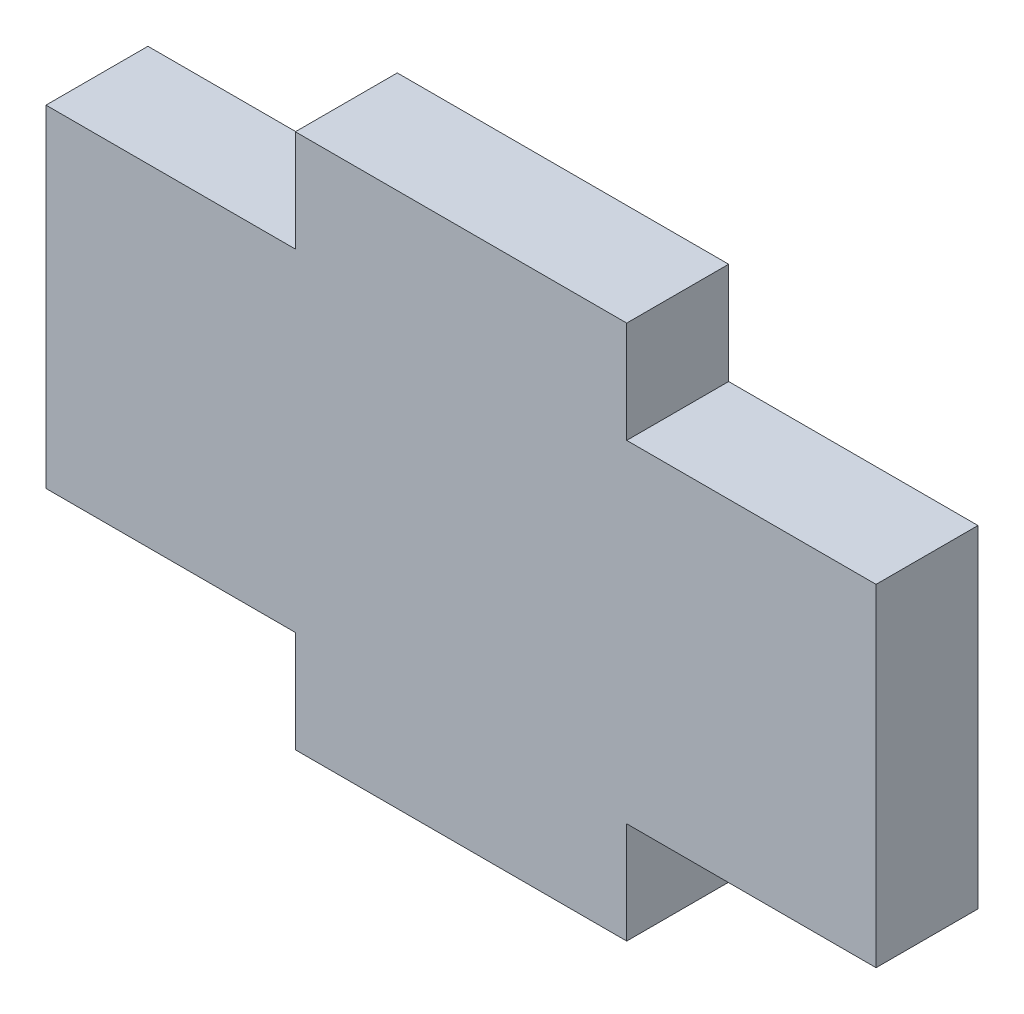
ISO-10303-21;
HEADER;
FILE_DESCRIPTION(('STEP AP214'),'2;1');
FILE_NAME('part.step','',(''),(''),'','','');
FILE_SCHEMA(('AUTOMOTIVE_DESIGN { 1 0 10303 214 1 1 1 1 }'));
ENDSEC;
DATA;
#1=APPLICATION_CONTEXT('core data for automotive mechanical design processes');
#2=APPLICATION_PROTOCOL_DEFINITION('international standard','automotive_design',2000,#1);
#3=PRODUCT_CONTEXT('',#1,'mechanical');
#4=PRODUCT('Part','Part','',(#3));
#5=PRODUCT_RELATED_PRODUCT_CATEGORY('part','',(#4));
#6=PRODUCT_DEFINITION_FORMATION('','',#4);
#7=PRODUCT_DEFINITION_CONTEXT('part definition',#1,'design');
#8=PRODUCT_DEFINITION('design','',#6,#7);
#9=PRODUCT_DEFINITION_SHAPE('','',#8);
#10=(LENGTH_UNIT() NAMED_UNIT(*) SI_UNIT(.MILLI.,.METRE.));
#11=(NAMED_UNIT(*) PLANE_ANGLE_UNIT() SI_UNIT($,.RADIAN.));
#12=(NAMED_UNIT(*) SI_UNIT($,.STERADIAN.) SOLID_ANGLE_UNIT());
#13=UNCERTAINTY_MEASURE_WITH_UNIT(LENGTH_MEASURE(1.E-05),#10,'distance_accuracy_value','');
#14=(GEOMETRIC_REPRESENTATION_CONTEXT(3) GLOBAL_UNCERTAINTY_ASSIGNED_CONTEXT((#13)) GLOBAL_UNIT_ASSIGNED_CONTEXT((#10,
#11,#12)) REPRESENTATION_CONTEXT('',''));
#15=CARTESIAN_POINT('',(0.,0.,0.));
#16=DIRECTION('',(0.,0.,1.));
#17=DIRECTION('',(1.,0.,0.));
#18=AXIS2_PLACEMENT_3D('',#15,#16,#17);
#19=CARTESIAN_POINT('',(-24.99,-295.75,-3.08));
#20=DIRECTION('',(0.,-1.,0.));
#21=DIRECTION('',(0.,0.,-1.));
#22=AXIS2_PLACEMENT_3D('',#19,#20,#21);
#23=PLANE('',#22);
#24=DIRECTION('',(1.,0.,0.));
#25=VECTOR('',#24,1.);
#26=CARTESIAN_POINT('',(-24.99,-295.75,-6.15));
#27=LINE('',#26,#25);
#28=CARTESIAN_POINT('',(-24.99,-295.75,-6.15));
#29=VERTEX_POINT('',#28);
#30=CARTESIAN_POINT('',(-15.01,-295.75,-6.15));
#31=VERTEX_POINT('',#30);
#32=EDGE_CURVE('E163',#29,#31,#27,.T.);
#33=ORIENTED_EDGE('',*,*,#32,.F.);
#34=DIRECTION('',(0.,0.,-1.));
#35=VECTOR('',#34,1.);
#36=CARTESIAN_POINT('',(-24.99,-295.75,-3.08));
#37=LINE('',#36,#35);
#38=CARTESIAN_POINT('',(-24.99,-295.75,-3.08));
#39=VERTEX_POINT('',#38);
#40=EDGE_CURVE('E162',#39,#29,#37,.T.);
#41=ORIENTED_EDGE('',*,*,#40,.F.);
#42=DIRECTION('',(1.,0.,0.));
#43=VECTOR('',#42,1.);
#44=CARTESIAN_POINT('',(-24.99,-295.75,-3.08));
#45=LINE('',#44,#43);
#46=CARTESIAN_POINT('',(-15.01,-295.75,-3.08));
#47=VERTEX_POINT('',#46);
#48=EDGE_CURVE('E193',#39,#47,#45,.T.);
#49=ORIENTED_EDGE('',*,*,#48,.T.);
#50=DIRECTION('',(0.,0.,-1.));
#51=VECTOR('',#50,1.);
#52=CARTESIAN_POINT('',(-15.01,-295.75,-3.08));
#53=LINE('',#52,#51);
#54=EDGE_CURVE('E11',#47,#31,#53,.T.);
#55=ORIENTED_EDGE('',*,*,#54,.T.);
#56=EDGE_LOOP('',(#33,#41,#49,#55));
#57=FACE_BOUND('',#56,.T.);
#58=ADVANCED_FACE('F43',(#57),#23,.F.);
#59=CARTESIAN_POINT('',(-15.01,-295.75,-3.08));
#60=DIRECTION('',(-1.,0.,0.));
#61=DIRECTION('',(0.,0.,-1.));
#62=AXIS2_PLACEMENT_3D('',#59,#60,#61);
#63=PLANE('',#62);
#64=DIRECTION('',(0.,-1.,0.));
#65=VECTOR('',#64,1.);
#66=CARTESIAN_POINT('',(-15.01,-295.75,-6.15));
#67=LINE('',#66,#65);
#68=CARTESIAN_POINT('',(-15.01,-298.81,-6.15));
#69=VERTEX_POINT('',#68);
#70=EDGE_CURVE('E165',#31,#69,#67,.T.);
#71=ORIENTED_EDGE('',*,*,#70,.F.);
#72=ORIENTED_EDGE('',*,*,#54,.F.);
#73=DIRECTION('',(0.,-1.,0.));
#74=VECTOR('',#73,1.);
#75=CARTESIAN_POINT('',(-15.01,-295.75,-3.08));
#76=LINE('',#75,#74);
#77=CARTESIAN_POINT('',(-15.01,-298.81,-3.08));
#78=VERTEX_POINT('',#77);
#79=EDGE_CURVE('E109',#47,#78,#76,.T.);
#80=ORIENTED_EDGE('',*,*,#79,.T.);
#81=DIRECTION('',(0.,0.,-1.));
#82=VECTOR('',#81,1.);
#83=CARTESIAN_POINT('',(-15.01,-298.81,-3.08));
#84=LINE('',#83,#82);
#85=EDGE_CURVE('E51',#78,#69,#84,.T.);
#86=ORIENTED_EDGE('',*,*,#85,.T.);
#87=EDGE_LOOP('',(#71,#72,#80,#86));
#88=FACE_BOUND('',#87,.T.);
#89=ADVANCED_FACE('F217',(#88),#63,.F.);
#90=CARTESIAN_POINT('',(-15.01,-298.81,-3.08));
#91=DIRECTION('',(0.,-1.,0.));
#92=DIRECTION('',(0.,0.,-1.));
#93=AXIS2_PLACEMENT_3D('',#90,#91,#92);
#94=PLANE('',#93);
#95=DIRECTION('',(1.,0.,0.));
#96=VECTOR('',#95,1.);
#97=CARTESIAN_POINT('',(-15.01,-298.81,-6.15));
#98=LINE('',#97,#96);
#99=CARTESIAN_POINT('',(-7.5,-298.81,-6.15));
#100=VERTEX_POINT('',#99);
#101=EDGE_CURVE('E168',#69,#100,#98,.T.);
#102=ORIENTED_EDGE('',*,*,#101,.F.);
#103=ORIENTED_EDGE('',*,*,#85,.F.);
#104=DIRECTION('',(1.,0.,0.));
#105=VECTOR('',#104,1.);
#106=CARTESIAN_POINT('',(-15.01,-298.81,-3.08));
#107=LINE('',#106,#105);
#108=CARTESIAN_POINT('',(-7.5,-298.81,-3.08));
#109=VERTEX_POINT('',#108);
#110=EDGE_CURVE('E226',#78,#109,#107,.T.);
#111=ORIENTED_EDGE('',*,*,#110,.T.);
#112=DIRECTION('',(0.,0.,-1.));
#113=VECTOR('',#112,1.);
#114=CARTESIAN_POINT('',(-7.5,-298.81,-3.08));
#115=LINE('',#114,#113);
#116=EDGE_CURVE('E212',#109,#100,#115,.T.);
#117=ORIENTED_EDGE('',*,*,#116,.T.);
#118=EDGE_LOOP('',(#102,#103,#111,#117));
#119=FACE_BOUND('',#118,.T.);
#120=ADVANCED_FACE('F260',(#119),#94,.F.);
#121=CARTESIAN_POINT('',(-7.5,-298.81,-3.08));
#122=DIRECTION('',(-1.,0.,0.));
#123=DIRECTION('',(0.,1.,0.));
#124=AXIS2_PLACEMENT_3D('',#121,#122,#123);
#125=PLANE('',#124);
#126=DIRECTION('',(0.,-1.,0.));
#127=VECTOR('',#126,1.);
#128=CARTESIAN_POINT('',(-7.5,-298.81,-6.15));
#129=LINE('',#128,#127);
#130=CARTESIAN_POINT('',(-7.5,-308.81,-6.15));
#131=VERTEX_POINT('',#130);
#132=EDGE_CURVE('E171',#100,#131,#129,.T.);
#133=ORIENTED_EDGE('',*,*,#132,.F.);
#134=ORIENTED_EDGE('',*,*,#116,.F.);
#135=DIRECTION('',(0.,-1.,0.));
#136=VECTOR('',#135,1.);
#137=CARTESIAN_POINT('',(-7.5,-298.81,-3.08));
#138=LINE('',#137,#136);
#139=CARTESIAN_POINT('',(-7.5,-308.81,-3.08));
#140=VERTEX_POINT('',#139);
#141=EDGE_CURVE('E230',#109,#140,#138,.T.);
#142=ORIENTED_EDGE('',*,*,#141,.T.);
#143=DIRECTION('',(0.,0.,-1.));
#144=VECTOR('',#143,1.);
#145=CARTESIAN_POINT('',(-7.5,-308.81,-3.08));
#146=LINE('',#145,#144);
#147=EDGE_CURVE('E209',#140,#131,#146,.T.);
#148=ORIENTED_EDGE('',*,*,#147,.T.);
#149=EDGE_LOOP('',(#133,#134,#142,#148));
#150=FACE_BOUND('',#149,.T.);
#151=ADVANCED_FACE('F259',(#150),#125,.F.);
#152=CARTESIAN_POINT('',(-7.5,-308.81,-3.08));
#153=DIRECTION('',(0.,1.,0.));
#154=DIRECTION('',(0.,0.,1.));
#155=AXIS2_PLACEMENT_3D('',#152,#153,#154);
#156=PLANE('',#155);
#157=DIRECTION('',(-1.,0.,0.));
#158=VECTOR('',#157,1.);
#159=CARTESIAN_POINT('',(-7.5,-308.81,-6.15));
#160=LINE('',#159,#158);
#161=CARTESIAN_POINT('',(-15.01,-308.81,-6.15));
#162=VERTEX_POINT('',#161);
#163=EDGE_CURVE('E174',#131,#162,#160,.T.);
#164=ORIENTED_EDGE('',*,*,#163,.F.);
#165=ORIENTED_EDGE('',*,*,#147,.F.);
#166=DIRECTION('',(-1.,0.,0.));
#167=VECTOR('',#166,1.);
#168=CARTESIAN_POINT('',(-7.5,-308.81,-3.08));
#169=LINE('',#168,#167);
#170=CARTESIAN_POINT('',(-15.01,-308.81,-3.08));
#171=VERTEX_POINT('',#170);
#172=EDGE_CURVE('E233',#140,#171,#169,.T.);
#173=ORIENTED_EDGE('',*,*,#172,.T.);
#174=DIRECTION('',(0.,0.,-1.));
#175=VECTOR('',#174,1.);
#176=CARTESIAN_POINT('',(-15.01,-308.81,-3.08));
#177=LINE('',#176,#175);
#178=EDGE_CURVE('E206',#171,#162,#177,.T.);
#179=ORIENTED_EDGE('',*,*,#178,.T.);
#180=EDGE_LOOP('',(#164,#165,#173,#179));
#181=FACE_BOUND('',#180,.T.);
#182=ADVANCED_FACE('F257',(#181),#156,.F.);
#183=CARTESIAN_POINT('',(-15.01,-308.81,-3.08));
#184=DIRECTION('',(-1.,0.,0.));
#185=DIRECTION('',(0.,0.,-1.));
#186=AXIS2_PLACEMENT_3D('',#183,#184,#185);
#187=PLANE('',#186);
#188=DIRECTION('',(0.,-1.,0.));
#189=VECTOR('',#188,1.);
#190=CARTESIAN_POINT('',(-15.01,-308.81,-6.15));
#191=LINE('',#190,#189);
#192=CARTESIAN_POINT('',(-15.01,-311.87,-6.15));
#193=VERTEX_POINT('',#192);
#194=EDGE_CURVE('E177',#162,#193,#191,.T.);
#195=ORIENTED_EDGE('',*,*,#194,.F.);
#196=ORIENTED_EDGE('',*,*,#178,.F.);
#197=DIRECTION('',(0.,-1.,0.));
#198=VECTOR('',#197,1.);
#199=CARTESIAN_POINT('',(-15.01,-308.81,-3.08));
#200=LINE('',#199,#198);
#201=CARTESIAN_POINT('',(-15.01,-311.87,-3.08));
#202=VERTEX_POINT('',#201);
#203=EDGE_CURVE('E236',#171,#202,#200,.T.);
#204=ORIENTED_EDGE('',*,*,#203,.T.);
#205=DIRECTION('',(0.,0.,-1.));
#206=VECTOR('',#205,1.);
#207=CARTESIAN_POINT('',(-15.01,-311.87,-3.08));
#208=LINE('',#207,#206);
#209=EDGE_CURVE('E203',#202,#193,#208,.T.);
#210=ORIENTED_EDGE('',*,*,#209,.T.);
#211=EDGE_LOOP('',(#195,#196,#204,#210));
#212=FACE_BOUND('',#211,.T.);
#213=ADVANCED_FACE('F253',(#212),#187,.F.);
#214=CARTESIAN_POINT('',(-15.01,-311.87,-3.08));
#215=DIRECTION('',(0.,1.,0.));
#216=DIRECTION('',(0.,0.,1.));
#217=AXIS2_PLACEMENT_3D('',#214,#215,#216);
#218=PLANE('',#217);
#219=DIRECTION('',(-1.,0.,0.));
#220=VECTOR('',#219,1.);
#221=CARTESIAN_POINT('',(-15.01,-311.87,-6.15));
#222=LINE('',#221,#220);
#223=CARTESIAN_POINT('',(-24.99,-311.87,-6.15));
#224=VERTEX_POINT('',#223);
#225=EDGE_CURVE('E180',#193,#224,#222,.T.);
#226=ORIENTED_EDGE('',*,*,#225,.F.);
#227=ORIENTED_EDGE('',*,*,#209,.F.);
#228=DIRECTION('',(-1.,0.,0.));
#229=VECTOR('',#228,1.);
#230=CARTESIAN_POINT('',(-15.01,-311.87,-3.08));
#231=LINE('',#230,#229);
#232=CARTESIAN_POINT('',(-24.99,-311.87,-3.08));
#233=VERTEX_POINT('',#232);
#234=EDGE_CURVE('E239',#202,#233,#231,.T.);
#235=ORIENTED_EDGE('',*,*,#234,.T.);
#236=DIRECTION('',(0.,0.,-1.));
#237=VECTOR('',#236,1.);
#238=CARTESIAN_POINT('',(-24.99,-311.87,-3.08));
#239=LINE('',#238,#237);
#240=EDGE_CURVE('E200',#233,#224,#239,.T.);
#241=ORIENTED_EDGE('',*,*,#240,.T.);
#242=EDGE_LOOP('',(#226,#227,#235,#241));
#243=FACE_BOUND('',#242,.T.);
#244=ADVANCED_FACE('F250',(#243),#218,.F.);
#245=CARTESIAN_POINT('',(-24.99,-311.87,-3.08));
#246=DIRECTION('',(1.,0.,0.));
#247=DIRECTION('',(0.,0.,1.));
#248=AXIS2_PLACEMENT_3D('',#245,#246,#247);
#249=PLANE('',#248);
#250=DIRECTION('',(0.,1.,0.));
#251=VECTOR('',#250,1.);
#252=CARTESIAN_POINT('',(-24.99,-311.87,-6.15));
#253=LINE('',#252,#251);
#254=CARTESIAN_POINT('',(-24.99,-308.81,-6.15));
#255=VERTEX_POINT('',#254);
#256=EDGE_CURVE('E183',#224,#255,#253,.T.);
#257=ORIENTED_EDGE('',*,*,#256,.F.);
#258=ORIENTED_EDGE('',*,*,#240,.F.);
#259=DIRECTION('',(0.,1.,0.));
#260=VECTOR('',#259,1.);
#261=CARTESIAN_POINT('',(-24.99,-311.87,-3.08));
#262=LINE('',#261,#260);
#263=CARTESIAN_POINT('',(-24.99,-308.81,-3.08));
#264=VERTEX_POINT('',#263);
#265=EDGE_CURVE('E157',#233,#264,#262,.T.);
#266=ORIENTED_EDGE('',*,*,#265,.T.);
#267=DIRECTION('',(0.,0.,-1.));
#268=VECTOR('',#267,1.);
#269=CARTESIAN_POINT('',(-24.99,-308.81,-3.08));
#270=LINE('',#269,#268);
#271=EDGE_CURVE('E197',#264,#255,#270,.T.);
#272=ORIENTED_EDGE('',*,*,#271,.T.);
#273=EDGE_LOOP('',(#257,#258,#266,#272));
#274=FACE_BOUND('',#273,.T.);
#275=ADVANCED_FACE('F244',(#274),#249,.F.);
#276=CARTESIAN_POINT('',(-24.99,-308.81,-3.08));
#277=DIRECTION('',(0.,1.,0.));
#278=DIRECTION('',(0.,0.,1.));
#279=AXIS2_PLACEMENT_3D('',#276,#277,#278);
#280=PLANE('',#279);
#281=DIRECTION('',(-1.,0.,0.));
#282=VECTOR('',#281,1.);
#283=CARTESIAN_POINT('',(-24.99,-308.81,-6.15));
#284=LINE('',#283,#282);
#285=CARTESIAN_POINT('',(-32.5,-308.81,-6.15));
#286=VERTEX_POINT('',#285);
#287=EDGE_CURVE('E186',#255,#286,#284,.T.);
#288=ORIENTED_EDGE('',*,*,#287,.F.);
#289=ORIENTED_EDGE('',*,*,#271,.F.);
#290=DIRECTION('',(-1.,0.,0.));
#291=VECTOR('',#290,1.);
#292=CARTESIAN_POINT('',(-24.99,-308.81,-3.08));
#293=LINE('',#292,#291);
#294=CARTESIAN_POINT('',(-32.5,-308.81,-3.08));
#295=VERTEX_POINT('',#294);
#296=EDGE_CURVE('E155',#264,#295,#293,.T.);
#297=ORIENTED_EDGE('',*,*,#296,.T.);
#298=DIRECTION('',(0.,0.,-1.));
#299=VECTOR('',#298,1.);
#300=CARTESIAN_POINT('',(-32.5,-308.81,-3.08));
#301=LINE('',#300,#299);
#302=EDGE_CURVE('E149',#295,#286,#301,.T.);
#303=ORIENTED_EDGE('',*,*,#302,.T.);
#304=EDGE_LOOP('',(#288,#289,#297,#303));
#305=FACE_BOUND('',#304,.T.);
#306=ADVANCED_FACE('F248',(#305),#280,.F.);
#307=CARTESIAN_POINT('',(-32.5,-308.81,-3.08));
#308=DIRECTION('',(1.,0.,0.));
#309=DIRECTION('',(0.,0.,1.));
#310=AXIS2_PLACEMENT_3D('',#307,#308,#309);
#311=PLANE('',#310);
#312=DIRECTION('',(0.,1.,0.));
#313=VECTOR('',#312,1.);
#314=CARTESIAN_POINT('',(-32.5,-308.81,-6.15));
#315=LINE('',#314,#313);
#316=CARTESIAN_POINT('',(-32.5,-298.81,-6.15));
#317=VERTEX_POINT('',#316);
#318=EDGE_CURVE('E189',#286,#317,#315,.T.);
#319=ORIENTED_EDGE('',*,*,#318,.F.);
#320=ORIENTED_EDGE('',*,*,#302,.F.);
#321=DIRECTION('',(0.,1.,0.));
#322=VECTOR('',#321,1.);
#323=CARTESIAN_POINT('',(-32.5,-308.81,-3.08));
#324=LINE('',#323,#322);
#325=CARTESIAN_POINT('',(-32.5,-298.81,-3.08));
#326=VERTEX_POINT('',#325);
#327=EDGE_CURVE('E139',#295,#326,#324,.T.);
#328=ORIENTED_EDGE('',*,*,#327,.T.);
#329=DIRECTION('',(0.,0.,-1.));
#330=VECTOR('',#329,1.);
#331=CARTESIAN_POINT('',(-32.5,-298.81,-3.08));
#332=LINE('',#331,#330);
#333=EDGE_CURVE('E144',#326,#317,#332,.T.);
#334=ORIENTED_EDGE('',*,*,#333,.T.);
#335=EDGE_LOOP('',(#319,#320,#328,#334));
#336=FACE_BOUND('',#335,.T.);
#337=ADVANCED_FACE('F152',(#336),#311,.F.);
#338=CARTESIAN_POINT('',(-32.5,-298.81,-3.08));
#339=DIRECTION('',(0.,-1.,0.));
#340=DIRECTION('',(0.,0.,-1.));
#341=AXIS2_PLACEMENT_3D('',#338,#339,#340);
#342=PLANE('',#341);
#343=DIRECTION('',(1.,0.,0.));
#344=VECTOR('',#343,1.);
#345=CARTESIAN_POINT('',(-32.5,-298.81,-6.15));
#346=LINE('',#345,#344);
#347=CARTESIAN_POINT('',(-24.99,-298.81,-6.15));
#348=VERTEX_POINT('',#347);
#349=EDGE_CURVE('E146',#317,#348,#346,.T.);
#350=ORIENTED_EDGE('',*,*,#349,.F.);
#351=ORIENTED_EDGE('',*,*,#333,.F.);
#352=DIRECTION('',(1.,0.,0.));
#353=VECTOR('',#352,1.);
#354=CARTESIAN_POINT('',(-32.5,-298.81,-3.08));
#355=LINE('',#354,#353);
#356=CARTESIAN_POINT('',(-24.99,-298.81,-3.08));
#357=VERTEX_POINT('',#356);
#358=EDGE_CURVE('E135',#326,#357,#355,.T.);
#359=ORIENTED_EDGE('',*,*,#358,.T.);
#360=DIRECTION('',(0.,0.,-1.));
#361=VECTOR('',#360,1.);
#362=CARTESIAN_POINT('',(-24.99,-298.81,-3.08));
#363=LINE('',#362,#361);
#364=EDGE_CURVE('E150',#357,#348,#363,.T.);
#365=ORIENTED_EDGE('',*,*,#364,.T.);
#366=EDGE_LOOP('',(#350,#351,#359,#365));
#367=FACE_BOUND('',#366,.T.);
#368=ADVANCED_FACE('F145',(#367),#342,.F.);
#369=CARTESIAN_POINT('',(-24.99,-298.81,-3.08));
#370=DIRECTION('',(1.,0.,0.));
#371=DIRECTION('',(0.,0.,1.));
#372=AXIS2_PLACEMENT_3D('',#369,#370,#371);
#373=PLANE('',#372);
#374=DIRECTION('',(0.,1.,0.));
#375=VECTOR('',#374,1.);
#376=CARTESIAN_POINT('',(-24.99,-298.81,-6.15));
#377=LINE('',#376,#375);
#378=EDGE_CURVE('E97',#348,#29,#377,.T.);
#379=ORIENTED_EDGE('',*,*,#378,.F.);
#380=ORIENTED_EDGE('',*,*,#364,.F.);
#381=DIRECTION('',(0.,1.,0.));
#382=VECTOR('',#381,1.);
#383=CARTESIAN_POINT('',(-24.99,-298.81,-3.08));
#384=LINE('',#383,#382);
#385=EDGE_CURVE('E59',#357,#39,#384,.T.);
#386=ORIENTED_EDGE('',*,*,#385,.T.);
#387=ORIENTED_EDGE('',*,*,#40,.T.);
#388=EDGE_LOOP('',(#379,#380,#386,#387));
#389=FACE_BOUND('',#388,.T.);
#390=ADVANCED_FACE('F337',(#389),#373,.F.);
#391=CARTESIAN_POINT('',(0.,0.,-3.08));
#392=DIRECTION('',(0.,0.,1.));
#393=DIRECTION('',(-1.,0.,0.));
#394=AXIS2_PLACEMENT_3D('',#391,#392,#393);
#395=PLANE('',#394);
#396=ORIENTED_EDGE('',*,*,#48,.F.);
#397=ORIENTED_EDGE('',*,*,#385,.F.);
#398=ORIENTED_EDGE('',*,*,#358,.F.);
#399=ORIENTED_EDGE('',*,*,#327,.F.);
#400=ORIENTED_EDGE('',*,*,#296,.F.);
#401=ORIENTED_EDGE('',*,*,#265,.F.);
#402=ORIENTED_EDGE('',*,*,#234,.F.);
#403=ORIENTED_EDGE('',*,*,#203,.F.);
#404=ORIENTED_EDGE('',*,*,#172,.F.);
#405=ORIENTED_EDGE('',*,*,#141,.F.);
#406=ORIENTED_EDGE('',*,*,#110,.F.);
#407=ORIENTED_EDGE('',*,*,#79,.F.);
#408=EDGE_LOOP('',(#396,#397,#398,#399,#400,#401,#402,#403,#404,#405,#406,#407));
#409=FACE_BOUND('',#408,.T.);
#410=ADVANCED_FACE('F137',(#409),#395,.T.);
#411=CARTESIAN_POINT('',(0.,0.,-6.15));
#412=DIRECTION('',(0.,0.,1.));
#413=DIRECTION('',(-1.,0.,0.));
#414=AXIS2_PLACEMENT_3D('',#411,#412,#413);
#415=PLANE('',#414);
#416=ORIENTED_EDGE('',*,*,#32,.T.);
#417=ORIENTED_EDGE('',*,*,#70,.T.);
#418=ORIENTED_EDGE('',*,*,#101,.T.);
#419=ORIENTED_EDGE('',*,*,#132,.T.);
#420=ORIENTED_EDGE('',*,*,#163,.T.);
#421=ORIENTED_EDGE('',*,*,#194,.T.);
#422=ORIENTED_EDGE('',*,*,#225,.T.);
#423=ORIENTED_EDGE('',*,*,#256,.T.);
#424=ORIENTED_EDGE('',*,*,#287,.T.);
#425=ORIENTED_EDGE('',*,*,#318,.T.);
#426=ORIENTED_EDGE('',*,*,#349,.T.);
#427=ORIENTED_EDGE('',*,*,#378,.T.);
#428=EDGE_LOOP('',(#416,#417,#418,#419,#420,#421,#422,#423,#424,#425,#426,#427));
#429=FACE_BOUND('',#428,.T.);
#430=ADVANCED_FACE('F220',(#429),#415,.F.);
#431=CLOSED_SHELL('',(#58,#89,#120,#151,#182,#213,#244,#275,#306,#337,#368,#390,#410,#430));
#432=MANIFOLD_SOLID_BREP('B2',#431);
#433=ADVANCED_BREP_SHAPE_REPRESENTATION('',(#18,#432),#14);
#434=SHAPE_DEFINITION_REPRESENTATION(#9,#433);
ENDSEC;
END-ISO-10303-21;
